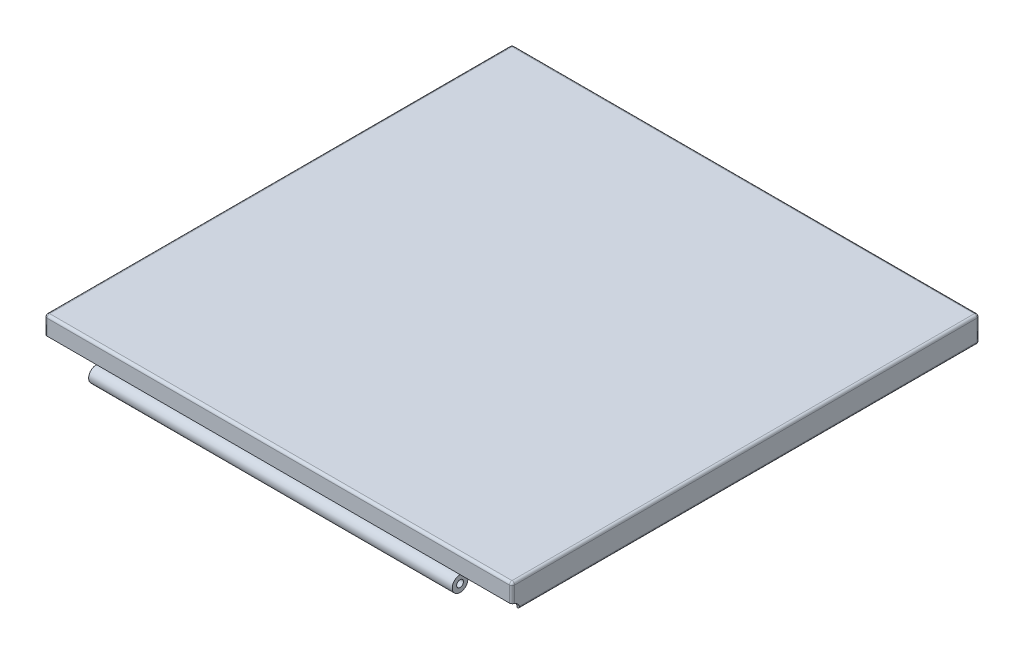
ISO-10303-21;
HEADER;
FILE_DESCRIPTION(('STEP AP214'),'2;1');
FILE_NAME('part.step','',(''),(''),'','','');
FILE_SCHEMA(('AUTOMOTIVE_DESIGN { 1 0 10303 214 1 1 1 1 }'));
ENDSEC;
DATA;
#1=APPLICATION_CONTEXT('core data for automotive mechanical design processes');
#2=APPLICATION_PROTOCOL_DEFINITION('international standard','automotive_design',2000,#1);
#3=PRODUCT_CONTEXT('',#1,'mechanical');
#4=PRODUCT('Part','Part','',(#3));
#5=PRODUCT_RELATED_PRODUCT_CATEGORY('part','',(#4));
#6=PRODUCT_DEFINITION_FORMATION('','',#4);
#7=PRODUCT_DEFINITION_CONTEXT('part definition',#1,'design');
#8=PRODUCT_DEFINITION('design','',#6,#7);
#9=PRODUCT_DEFINITION_SHAPE('','',#8);
#10=(LENGTH_UNIT() NAMED_UNIT(*) SI_UNIT(.MILLI.,.METRE.));
#11=(NAMED_UNIT(*) PLANE_ANGLE_UNIT() SI_UNIT($,.RADIAN.));
#12=(NAMED_UNIT(*) SI_UNIT($,.STERADIAN.) SOLID_ANGLE_UNIT());
#13=UNCERTAINTY_MEASURE_WITH_UNIT(LENGTH_MEASURE(1.E-05),#10,'distance_accuracy_value','');
#14=(GEOMETRIC_REPRESENTATION_CONTEXT(3) GLOBAL_UNCERTAINTY_ASSIGNED_CONTEXT((#13)) GLOBAL_UNIT_ASSIGNED_CONTEXT((#10,
#11,#12)) REPRESENTATION_CONTEXT('',''));
#15=CARTESIAN_POINT('',(0.,0.,0.));
#16=DIRECTION('',(0.,0.,1.));
#17=DIRECTION('',(1.,0.,0.));
#18=AXIS2_PLACEMENT_3D('',#15,#16,#17);
#19=CARTESIAN_POINT('',(114.3,12.7,114.3));
#20=DIRECTION('',(0.,0.,-1.));
#21=DIRECTION('',(-1.,0.,0.));
#22=AXIS2_PLACEMENT_3D('',#19,#20,#21);
#23=PLANE('',#22);
#24=DIRECTION('',(1.,0.,0.));
#25=VECTOR('',#24,1.);
#26=CARTESIAN_POINT('',(-125.076307345283,3.81000000000001,114.3));
#27=LINE('',#26,#25);
#28=CARTESIAN_POINT('',(-88.9,3.81000000000001,114.3));
#29=VERTEX_POINT('',#28);
#30=CARTESIAN_POINT('',(-113.03,3.81000000000001,114.3));
#31=VERTEX_POINT('',#30);
#32=EDGE_CURVE('E172',#29,#31,#27,.F.);
#33=ORIENTED_EDGE('',*,*,#32,.F.);
#34=DIRECTION('',(-1.,0.,0.));
#35=VECTOR('',#34,1.);
#36=CARTESIAN_POINT('',(88.9,3.81000000000001,114.3));
#37=LINE('',#36,#35);
#38=CARTESIAN_POINT('',(88.9,3.81000000000001,114.3));
#39=VERTEX_POINT('',#38);
#40=EDGE_CURVE('E259',#39,#29,#37,.T.);
#41=ORIENTED_EDGE('',*,*,#40,.F.);
#42=DIRECTION('',(-1.,0.,0.));
#43=VECTOR('',#42,1.);
#44=CARTESIAN_POINT('',(125.076307345283,3.81000000000001,114.3));
#45=LINE('',#44,#43);
#46=CARTESIAN_POINT('',(113.03,3.81000000000001,114.3));
#47=VERTEX_POINT('',#46);
#48=EDGE_CURVE('E489',#47,#39,#45,.T.);
#49=ORIENTED_EDGE('',*,*,#48,.F.);
#50=DIRECTION('',(0.,-1.,0.));
#51=VECTOR('',#50,1.);
#52=CARTESIAN_POINT('',(113.03,12.7,114.3));
#53=LINE('',#52,#51);
#54=CARTESIAN_POINT('',(113.03,11.43,114.3));
#55=VERTEX_POINT('',#54);
#56=EDGE_CURVE('E238',#47,#55,#53,.F.);
#57=ORIENTED_EDGE('',*,*,#56,.T.);
#58=DIRECTION('',(1.,0.,0.));
#59=VECTOR('',#58,1.);
#60=CARTESIAN_POINT('',(-114.3,11.43,114.3));
#61=LINE('',#60,#59);
#62=CARTESIAN_POINT('',(-113.03,11.43,114.3));
#63=VERTEX_POINT('',#62);
#64=EDGE_CURVE('E235',#55,#63,#61,.F.);
#65=ORIENTED_EDGE('',*,*,#64,.T.);
#66=DIRECTION('',(0.,-1.,0.));
#67=VECTOR('',#66,1.);
#68=CARTESIAN_POINT('',(-113.03,12.7,114.3));
#69=LINE('',#68,#67);
#70=EDGE_CURVE('E241',#63,#31,#69,.T.);
#71=ORIENTED_EDGE('',*,*,#70,.T.);
#72=EDGE_LOOP('',(#33,#41,#49,#57,#65,#71));
#73=FACE_BOUND('',#72,.T.);
#74=ADVANCED_FACE('F44',(#73),#23,.F.);
#75=CARTESIAN_POINT('',(114.3,12.7,113.03));
#76=DIRECTION('',(0.,0.,-1.));
#77=DIRECTION('',(-1.,0.,0.));
#78=AXIS2_PLACEMENT_3D('',#75,#76,#77);
#79=PLANE('',#78);
#80=DIRECTION('',(-1.,0.,0.));
#81=VECTOR('',#80,1.);
#82=CARTESIAN_POINT('',(88.9,3.59210244842768,113.03));
#83=LINE('',#82,#81);
#84=CARTESIAN_POINT('',(88.9,3.59210244842768,113.03));
#85=VERTEX_POINT('',#84);
#86=CARTESIAN_POINT('',(-88.9,3.59210244842769,113.03));
#87=VERTEX_POINT('',#86);
#88=EDGE_CURVE('E53',#85,#87,#83,.T.);
#89=ORIENTED_EDGE('',*,*,#88,.T.);
#90=DIRECTION('',(1.,0.,0.));
#91=VECTOR('',#90,1.);
#92=CARTESIAN_POINT('',(-125.076307345283,3.59210244842769,113.03));
#93=LINE('',#92,#91);
#94=CARTESIAN_POINT('',(-113.03,3.59210244842769,113.03));
#95=VERTEX_POINT('',#94);
#96=EDGE_CURVE('E178',#87,#95,#93,.F.);
#97=ORIENTED_EDGE('',*,*,#96,.T.);
#98=DIRECTION('',(0.,-1.,0.));
#99=VECTOR('',#98,1.);
#100=CARTESIAN_POINT('',(-113.03,12.7,113.03));
#101=LINE('',#100,#99);
#102=CARTESIAN_POINT('',(-113.03,11.43,113.03));
#103=VERTEX_POINT('',#102);
#104=EDGE_CURVE('E202',#103,#95,#101,.T.);
#105=ORIENTED_EDGE('',*,*,#104,.F.);
#106=DIRECTION('',(1.,0.,0.));
#107=VECTOR('',#106,1.);
#108=CARTESIAN_POINT('',(114.3,11.43,113.03));
#109=LINE('',#108,#107);
#110=CARTESIAN_POINT('',(113.03,11.43,113.03));
#111=VERTEX_POINT('',#110);
#112=EDGE_CURVE('E364',#103,#111,#109,.T.);
#113=ORIENTED_EDGE('',*,*,#112,.T.);
#114=DIRECTION('',(0.,-1.,0.));
#115=VECTOR('',#114,1.);
#116=CARTESIAN_POINT('',(113.03,12.7,113.03));
#117=LINE('',#116,#115);
#118=CARTESIAN_POINT('',(113.03,3.59210244842768,113.03));
#119=VERTEX_POINT('',#118);
#120=EDGE_CURVE('E359',#111,#119,#117,.T.);
#121=ORIENTED_EDGE('',*,*,#120,.T.);
#122=DIRECTION('',(-1.,0.,0.));
#123=VECTOR('',#122,1.);
#124=CARTESIAN_POINT('',(125.076307345283,3.59210244842768,113.03));
#125=LINE('',#124,#123);
#126=EDGE_CURVE('E332',#119,#85,#125,.T.);
#127=ORIENTED_EDGE('',*,*,#126,.T.);
#128=EDGE_LOOP('',(#89,#97,#105,#113,#121,#127));
#129=FACE_BOUND('',#128,.T.);
#130=ADVANCED_FACE('F328',(#129),#79,.T.);
#131=CARTESIAN_POINT('',(-114.3,0.,114.3));
#132=DIRECTION('',(1.,0.,0.));
#133=DIRECTION('',(0.,0.,-1.));
#134=AXIS2_PLACEMENT_3D('',#131,#132,#133);
#135=CYLINDRICAL_SURFACE('',#134,1.65099999999998);
#136=CARTESIAN_POINT('',(88.9,0.,114.3));
#137=DIRECTION('',(1.,0.,0.));
#138=DIRECTION('',(0.,0.,-1.));
#139=AXIS2_PLACEMENT_3D('',#136,#137,#138);
#140=CIRCLE('',#139,1.65099999999998);
#141=CARTESIAN_POINT('',(88.9,0.,112.649));
#142=VERTEX_POINT('',#141);
#143=EDGE_CURVE('E352',#142,#142,#140,.T.);
#144=CARTESIAN_POINT('',(-88.9,0.,114.3));
#145=DIRECTION('',(1.,0.,0.));
#146=DIRECTION('',(0.,0.,-1.));
#147=AXIS2_PLACEMENT_3D('',#144,#145,#146);
#148=CIRCLE('',#147,1.65099999999998);
#149=CARTESIAN_POINT('',(-88.9,0.,112.649));
#150=VERTEX_POINT('',#149);
#151=EDGE_CURVE('E11',#150,#150,#148,.T.);
#152=CARTESIAN_POINT('',(88.9,0.,112.649));
#153=CARTESIAN_POINT('',(87.0479166666667,0.,112.649));
#154=CARTESIAN_POINT('',(85.1958333333333,0.,112.649));
#155=CARTESIAN_POINT('',(81.4916666666667,0.,112.649));
#156=CARTESIAN_POINT('',(79.6395833333333,0.,112.649));
#157=CARTESIAN_POINT('',(75.9354166666667,0.,112.649));
#158=CARTESIAN_POINT('',(74.0833333333333,0.,112.649));
#159=CARTESIAN_POINT('',(70.3791666666667,0.,112.649));
#160=CARTESIAN_POINT('',(68.5270833333333,0.,112.649));
#161=CARTESIAN_POINT('',(64.8229166666667,0.,112.649));
#162=CARTESIAN_POINT('',(62.9708333333333,0.,112.649));
#163=CARTESIAN_POINT('',(59.2666666666667,0.,112.649));
#164=CARTESIAN_POINT('',(57.4145833333333,0.,112.649));
#165=CARTESIAN_POINT('',(53.7104166666666,0.,112.649));
#166=CARTESIAN_POINT('',(51.8583333333333,0.,112.649));
#167=CARTESIAN_POINT('',(48.1541666666667,0.,112.649));
#168=CARTESIAN_POINT('',(46.3020833333333,0.,112.649));
#169=CARTESIAN_POINT('',(42.5979166666667,0.,112.649));
#170=CARTESIAN_POINT('',(40.7458333333333,0.,112.649));
#171=CARTESIAN_POINT('',(37.0416666666667,0.,112.649));
#172=CARTESIAN_POINT('',(35.1895833333333,0.,112.649));
#173=CARTESIAN_POINT('',(31.4854166666666,0.,112.649));
#174=CARTESIAN_POINT('',(29.6333333333333,0.,112.649));
#175=CARTESIAN_POINT('',(25.9291666666667,0.,112.649));
#176=CARTESIAN_POINT('',(24.0770833333333,0.,112.649));
#177=CARTESIAN_POINT('',(20.3729166666666,0.,112.649));
#178=CARTESIAN_POINT('',(18.5208333333333,0.,112.649));
#179=CARTESIAN_POINT('',(14.8166666666666,0.,112.649));
#180=CARTESIAN_POINT('',(12.9645833333333,0.,112.649));
#181=CARTESIAN_POINT('',(9.26041666666666,0.,112.649));
#182=CARTESIAN_POINT('',(7.40833333333333,0.,112.649));
#183=CARTESIAN_POINT('',(3.70416666666667,0.,112.649));
#184=CARTESIAN_POINT('',(1.85208333333333,0.,112.649));
#185=CARTESIAN_POINT('',(-1.85208333333333,0.,112.649));
#186=CARTESIAN_POINT('',(-3.70416666666667,0.,112.649));
#187=CARTESIAN_POINT('',(-7.40833333333333,0.,112.649));
#188=CARTESIAN_POINT('',(-9.26041666666666,0.,112.649));
#189=CARTESIAN_POINT('',(-12.9645833333333,0.,112.649));
#190=CARTESIAN_POINT('',(-14.8166666666667,0.,112.649));
#191=CARTESIAN_POINT('',(-18.5208333333333,0.,112.649));
#192=CARTESIAN_POINT('',(-20.3729166666667,0.,112.649));
#193=CARTESIAN_POINT('',(-24.0770833333333,0.,112.649));
#194=CARTESIAN_POINT('',(-25.9291666666667,0.,112.649));
#195=CARTESIAN_POINT('',(-29.6333333333333,0.,112.649));
#196=CARTESIAN_POINT('',(-31.4854166666667,0.,112.649));
#197=CARTESIAN_POINT('',(-35.1895833333333,0.,112.649));
#198=CARTESIAN_POINT('',(-37.0416666666667,0.,112.649));
#199=CARTESIAN_POINT('',(-40.7458333333333,0.,112.649));
#200=CARTESIAN_POINT('',(-42.5979166666667,0.,112.649));
#201=CARTESIAN_POINT('',(-46.3020833333333,0.,112.649));
#202=CARTESIAN_POINT('',(-48.1541666666667,0.,112.649));
#203=CARTESIAN_POINT('',(-51.8583333333333,0.,112.649));
#204=CARTESIAN_POINT('',(-53.7104166666667,0.,112.649));
#205=CARTESIAN_POINT('',(-57.4145833333333,0.,112.649));
#206=CARTESIAN_POINT('',(-59.2666666666667,0.,112.649));
#207=CARTESIAN_POINT('',(-62.9708333333333,0.,112.649));
#208=CARTESIAN_POINT('',(-64.8229166666667,0.,112.649));
#209=CARTESIAN_POINT('',(-68.5270833333333,0.,112.649));
#210=CARTESIAN_POINT('',(-70.3791666666667,0.,112.649));
#211=CARTESIAN_POINT('',(-74.0833333333333,0.,112.649));
#212=CARTESIAN_POINT('',(-75.9354166666667,0.,112.649));
#213=CARTESIAN_POINT('',(-79.6395833333333,0.,112.649));
#214=CARTESIAN_POINT('',(-81.4916666666667,0.,112.649));
#215=CARTESIAN_POINT('',(-85.1958333333333,0.,112.649));
#216=CARTESIAN_POINT('',(-87.0479166666667,0.,112.649));
#217=CARTESIAN_POINT('',(-88.9,0.,112.649));
#218=B_SPLINE_CURVE_WITH_KNOTS('',3,(#152,#153,#154,#155,#156,#157,#158,#159,#160,#161,#162,
#163,#164,#165,#166,#167,#168,#169,#170,#171,#172,#173,#174,#175,#176,#177,#178,#179,#180,#181,
#182,#183,#184,#185,#186,#187,#188,#189,#190,#191,#192,#193,#194,#195,#196,#197,#198,#199,#200,
#201,#202,#203,#204,#205,#206,#207,#208,#209,#210,#211,#212,#213,#214,#215,#216,#217),
.UNSPECIFIED.,.F.,.F.,(4,2,2,2,2,2,2,2,2,2,2,2,2,2,2,2,2,2,2,2,2,2,2,2,2,2,2,2,2,2,2,2,4),(0.,
5.55625000000001,11.1125,16.66875,22.225,27.78125,33.3375,38.89375,44.45,50.00625,55.5625,
61.11875,66.675,72.23125,77.7875,83.34375,88.9,94.45625,100.0125,105.56875,111.125,116.68125,
122.2375,127.79375,133.35,138.90625,144.4625,150.01875,155.575,161.13125,166.6875,172.24375,
177.8),.UNSPECIFIED.);
#219=EDGE_CURVE('BSEAM479',#142,#150,#218,.T.);
#220=ORIENTED_EDGE('',*,*,#143,.T.);
#221=ORIENTED_EDGE('',*,*,#151,.F.);
#222=ORIENTED_EDGE('',*,*,#219,.T.);
#223=ORIENTED_EDGE('',*,*,#219,.F.);
#224=EDGE_LOOP('',(#220,#222,#221,#223));
#225=FACE_BOUND('',#224,.T.);
#226=ADVANCED_FACE('F479',(#225),#135,.F.);
#227=CARTESIAN_POINT('',(-113.03,12.7,113.03));
#228=DIRECTION('',(0.,-1.,0.));
#229=DIRECTION('',(0.,0.,-1.));
#230=AXIS2_PLACEMENT_3D('',#227,#228,#229);
#231=CYLINDRICAL_SURFACE('',#230,1.27);
#232=DIRECTION('',(0.,-1.,0.));
#233=VECTOR('',#232,1.);
#234=CARTESIAN_POINT('',(-114.3,12.7,113.03));
#235=LINE('',#234,#233);
#236=CARTESIAN_POINT('',(-114.3,3.59210244842769,113.03));
#237=VERTEX_POINT('',#236);
#238=CARTESIAN_POINT('',(-114.3,11.43,113.03));
#239=VERTEX_POINT('',#238);
#240=EDGE_CURVE('E183',#237,#239,#235,.F.);
#241=ORIENTED_EDGE('',*,*,#240,.F.);
#242=CARTESIAN_POINT('',(-114.3,3.59210244842769,113.03));
#243=CARTESIAN_POINT('',(-114.299999730832,3.60395342017345,113.063513010061));
#244=CARTESIAN_POINT('',(-114.298672245197,3.61532664849105,113.097182371875));
#245=CARTESIAN_POINT('',(-114.293297186261,3.63707352979692,113.164636357744));
#246=CARTESIAN_POINT('',(-114.289248832206,3.64744689489697,113.198421012114));
#247=CARTESIAN_POINT('',(-114.272934354231,3.67697435725504,113.29956477133));
#248=CARTESIAN_POINT('',(-114.256499033481,3.69455626429702,113.366771736512));
#249=CARTESIAN_POINT('',(-114.212436430446,3.7253816406979,113.498603936007));
#250=CARTESIAN_POINT('',(-114.184785078813,3.73861566835664,113.563223287607));
#251=CARTESIAN_POINT('',(-114.118824901333,3.76097389686656,113.68749677385));
#252=CARTESIAN_POINT('',(-114.080524187735,3.77010121224139,113.747154643186));
#253=CARTESIAN_POINT('',(-113.995484344228,3.78466964168169,113.857938660787));
#254=CARTESIAN_POINT('',(-113.949010439519,3.79020648988001,113.909256395814));
#255=CARTESIAN_POINT('',(-113.848200405144,3.79876341253541,114.003767749155));
#256=CARTESIAN_POINT('',(-113.793861104328,3.80178246854044,114.046958074451));
#257=CARTESIAN_POINT('',(-113.678228213804,3.80614891804898,114.124345865882));
#258=CARTESIAN_POINT('',(-113.616867155018,3.80747829482191,114.158443395245));
#259=CARTESIAN_POINT('',(-113.489369090119,3.80918485194009,114.216073772755));
#260=CARTESIAN_POINT('',(-113.423233607697,3.80956233469944,114.239609974254));
#261=CARTESIAN_POINT('',(-113.302555498846,3.80992133611994,114.2716243187));
#262=CARTESIAN_POINT('',(-113.248571589362,3.80997045548781,114.282250239369));
#263=CARTESIAN_POINT('',(-113.139731348591,3.80999976117242,114.296443304013));
#264=CARTESIAN_POINT('',(-113.084875805904,3.80998000662043,114.300016498936));
#265=CARTESIAN_POINT('',(-113.03,3.81000000000001,114.3));
#266=B_SPLINE_CURVE_WITH_KNOTS('',3,(#242,#243,#244,#245,#246,#247,#248,#249,#250,#251,#252,
#253,#254,#255,#256,#257,#258,#259,#260,#261,#262,#263,#264,#265),.UNSPECIFIED.,.F.,.F.,(4,2,2,
2,2,2,2,2,2,2,2,4),(0.,0.106585107547144,0.213200812786025,0.426249810301429,0.639758445608502,
0.853104882260133,1.06049936231199,1.26797769321732,1.47765026009959,1.68725620618885,
1.85187078374446,2.01634406729467),.UNSPECIFIED.);
#267=EDGE_CURVE('E169',#237,#31,#266,.T.);
#268=ORIENTED_EDGE('',*,*,#267,.T.);
#269=ORIENTED_EDGE('',*,*,#70,.F.);
#270=CARTESIAN_POINT('',(-113.03,11.43,113.03));
#271=DIRECTION('',(0.,1.,0.));
#272=DIRECTION('',(0.,0.,1.));
#273=AXIS2_PLACEMENT_3D('',#270,#271,#272);
#274=CIRCLE('',#273,1.27);
#275=EDGE_CURVE('E194',#63,#239,#274,.F.);
#276=ORIENTED_EDGE('',*,*,#275,.T.);
#277=EDGE_LOOP('',(#241,#268,#269,#276));
#278=FACE_BOUND('',#277,.T.);
#279=ADVANCED_FACE('F192',(#278),#231,.T.);
#280=CARTESIAN_POINT('',(-113.03,1.27,114.3));
#281=DIRECTION('',(0.,0.,1.));
#282=DIRECTION('',(1.,0.,0.));
#283=AXIS2_PLACEMENT_3D('',#280,#281,#282);
#284=CYLINDRICAL_SURFACE('',#283,1.27);
#285=DIRECTION('',(0.,0.,1.));
#286=VECTOR('',#285,1.);
#287=CARTESIAN_POINT('',(-113.03,0.,114.3));
#288=LINE('',#287,#286);
#289=CARTESIAN_POINT('',(-113.03,0.,-113.03));
#290=VERTEX_POINT('',#289);
#291=CARTESIAN_POINT('',(-113.03,0.,110.49));
#292=VERTEX_POINT('',#291);
#293=EDGE_CURVE('E321',#290,#292,#288,.T.);
#294=ORIENTED_EDGE('',*,*,#293,.T.);
#295=CARTESIAN_POINT('',(-113.03,0.,110.49));
#296=CARTESIAN_POINT('',(-113.06569180478,2.42712029706028E-07,110.490002882391));
#297=CARTESIAN_POINT('',(-113.101366521661,0.00150555562838172,110.489999675541));
#298=CARTESIAN_POINT('',(-113.172461393225,0.00751091564200149,110.490005658736));
#299=CARTESIAN_POINT('',(-113.207881558863,0.0120108330836344,110.490014848245));
#300=CARTESIAN_POINT('',(-113.313332076448,0.0299621750192666,110.490097788749));
#301=CARTESIAN_POINT('',(-113.382657438353,0.0478652915658304,110.490226777436));
#302=CARTESIAN_POINT('',(-113.517323023573,0.0950463010961808,110.49111348022));
#303=CARTESIAN_POINT('',(-113.582661069672,0.124330345291957,110.491871534568));
#304=CARTESIAN_POINT('',(-113.707479361027,0.193428776192033,110.494756732604));
#305=CARTESIAN_POINT('',(-113.766960560917,0.233241442873028,110.496883652747));
#306=CARTESIAN_POINT('',(-113.878077063348,0.322002694986323,110.503372664282));
#307=CARTESIAN_POINT('',(-113.929747326381,0.370908246093849,110.507724389338));
#308=CARTESIAN_POINT('',(-114.024058894266,0.476431717084375,110.519534033712));
#309=CARTESIAN_POINT('',(-114.066702527566,0.533047641845049,110.52699115051));
#310=CARTESIAN_POINT('',(-114.141074679166,0.650982315672664,110.545560775685));
#311=CARTESIAN_POINT('',(-114.172993710987,0.712192361402362,110.55660176584));
#312=CARTESIAN_POINT('',(-114.22630990199,0.838232674472518,110.582796232106));
#313=CARTESIAN_POINT('',(-114.247705403832,0.903063510258814,110.597950355406));
#314=CARTESIAN_POINT('',(-114.27593139301,1.01859311576174,110.62831953401));
#315=CARTESIAN_POINT('',(-114.28501495666,1.06898863718235,110.64266413315));
#316=CARTESIAN_POINT('',(-114.297052182924,1.16971861906002,110.673614998505));
#317=CARTESIAN_POINT('',(-114.300017030637,1.22005302253359,110.690217078668));
#318=CARTESIAN_POINT('',(-114.3,1.27,110.707897551572));
#319=B_SPLINE_CURVE_WITH_KNOTS('',3,(#295,#296,#297,#298,#299,#300,#301,#302,#303,#304,#305,
#306,#307,#308,#309,#310,#311,#312,#313,#314,#315,#316,#317,#318),.UNSPECIFIED.,.F.,.F.,(4,2,2,
2,2,2,2,2,2,2,2,4),(0.,0.107009736099259,0.214014839362178,0.427714078346772,0.641528979390755,
0.855308971815977,1.06810182698581,1.28083972451135,1.48956943609269,1.69833200981209,
1.85747904439642,2.01633489731665),.UNSPECIFIED.);
#320=CARTESIAN_POINT('',(-114.3,1.27,110.707897551572));
#321=VERTEX_POINT('',#320);
#322=EDGE_CURVE('E188',#292,#321,#319,.T.);
#323=ORIENTED_EDGE('',*,*,#322,.T.);
#324=DIRECTION('',(0.,0.,1.));
#325=VECTOR('',#324,1.);
#326=CARTESIAN_POINT('',(-114.3,1.27,114.3));
#327=LINE('',#326,#325);
#328=CARTESIAN_POINT('',(-114.3,1.27,-113.03));
#329=VERTEX_POINT('',#328);
#330=EDGE_CURVE('E186',#329,#321,#327,.T.);
#331=ORIENTED_EDGE('',*,*,#330,.F.);
#332=CARTESIAN_POINT('',(-113.03,1.27,-113.03));
#333=DIRECTION('',(0.,0.,-1.));
#334=DIRECTION('',(-1.,0.,0.));
#335=AXIS2_PLACEMENT_3D('',#332,#333,#334);
#336=CIRCLE('',#335,1.27);
#337=EDGE_CURVE('E255',#329,#290,#336,.F.);
#338=ORIENTED_EDGE('',*,*,#337,.T.);
#339=EDGE_LOOP('',(#294,#323,#331,#338));
#340=FACE_BOUND('',#339,.T.);
#341=ADVANCED_FACE('F494',(#340),#284,.T.);
#342=CARTESIAN_POINT('',(113.03,12.7,113.03));
#343=DIRECTION('',(0.,-1.,0.));
#344=DIRECTION('',(0.,0.,-1.));
#345=AXIS2_PLACEMENT_3D('',#342,#343,#344);
#346=CYLINDRICAL_SURFACE('',#345,1.27);
#347=ORIENTED_EDGE('',*,*,#56,.F.);
#348=CARTESIAN_POINT('',(113.03,3.81000000000001,114.3));
#349=CARTESIAN_POINT('',(113.06569180478,3.80999711760852,114.299999757288));
#350=CARTESIAN_POINT('',(113.101366521661,3.81000032445873,114.298494444372));
#351=CARTESIAN_POINT('',(113.172461393225,3.80999434126383,114.292489084358));
#352=CARTESIAN_POINT('',(113.207881558863,3.80998515175542,114.287989166916));
#353=CARTESIAN_POINT('',(113.313332076448,3.80990221125076,114.270037824981));
#354=CARTESIAN_POINT('',(113.382657438353,3.80977322256354,114.252134708434));
#355=CARTESIAN_POINT('',(113.517323023573,3.80888651978016,114.204953698904));
#356=CARTESIAN_POINT('',(113.582661069672,3.80812846543196,114.175669654708));
#357=CARTESIAN_POINT('',(113.707479361027,3.80524326739586,114.106571223808));
#358=CARTESIAN_POINT('',(113.766960560917,3.80311634725335,114.066758557127));
#359=CARTESIAN_POINT('',(113.878077063348,3.79662733571756,113.977997305014));
#360=CARTESIAN_POINT('',(113.929747326381,3.7922756106621,113.929091753906));
#361=CARTESIAN_POINT('',(114.024058894266,3.78046596628763,113.823568282916));
#362=CARTESIAN_POINT('',(114.066702527566,3.77300884949034,113.766952358155));
#363=CARTESIAN_POINT('',(114.141074679166,3.75443922431538,113.649017684327));
#364=CARTESIAN_POINT('',(114.172993710987,3.74339823415974,113.587807638598));
#365=CARTESIAN_POINT('',(114.22630990199,3.71720376789425,113.461767325527));
#366=CARTESIAN_POINT('',(114.247705403832,3.70204964459356,113.396936489741));
#367=CARTESIAN_POINT('',(114.27593139301,3.67168046598952,113.281406884238));
#368=CARTESIAN_POINT('',(114.28501495666,3.65733586685047,113.231011362818));
#369=CARTESIAN_POINT('',(114.297052182924,3.6263850014946,113.13028138094));
#370=CARTESIAN_POINT('',(114.300017030637,3.60978292133238,113.079946977466));
#371=CARTESIAN_POINT('',(114.3,3.59210244842768,113.03));
#372=B_SPLINE_CURVE_WITH_KNOTS('',3,(#348,#349,#350,#351,#352,#353,#354,#355,#356,#357,#358,
#359,#360,#361,#362,#363,#364,#365,#366,#367,#368,#369,#370,#371),.UNSPECIFIED.,.F.,.F.,(4,2,2,
2,2,2,2,2,2,2,2,4),(0.,0.107009736099258,0.214014839362178,0.427714078346774,0.641528979390771,
0.85530897181599,1.06810182698583,1.28083972451135,1.4895694360927,1.69833200981209,
1.85747904439641,2.01633489731663),.UNSPECIFIED.);
#373=CARTESIAN_POINT('',(114.3,3.59210244842768,113.03));
#374=VERTEX_POINT('',#373);
#375=EDGE_CURVE('E483',#47,#374,#372,.T.);
#376=ORIENTED_EDGE('',*,*,#375,.T.);
#377=DIRECTION('',(0.,-1.,0.));
#378=VECTOR('',#377,1.);
#379=CARTESIAN_POINT('',(114.3,12.7,113.03));
#380=LINE('',#379,#378);
#381=CARTESIAN_POINT('',(114.3,11.43,113.03));
#382=VERTEX_POINT('',#381);
#383=EDGE_CURVE('E224',#382,#374,#380,.T.);
#384=ORIENTED_EDGE('',*,*,#383,.F.);
#385=CARTESIAN_POINT('',(113.03,11.43,113.03));
#386=DIRECTION('',(0.,1.,0.));
#387=DIRECTION('',(0.,0.,1.));
#388=AXIS2_PLACEMENT_3D('',#385,#386,#387);
#389=CIRCLE('',#388,1.27);
#390=EDGE_CURVE('E299',#382,#55,#389,.F.);
#391=ORIENTED_EDGE('',*,*,#390,.T.);
#392=EDGE_LOOP('',(#347,#376,#384,#391));
#393=FACE_BOUND('',#392,.T.);
#394=ADVANCED_FACE('F490',(#393),#346,.T.);
#395=CARTESIAN_POINT('',(113.03,1.27,114.3));
#396=DIRECTION('',(0.,0.,-1.));
#397=DIRECTION('',(-1.,0.,0.));
#398=AXIS2_PLACEMENT_3D('',#395,#396,#397);
#399=CYLINDRICAL_SURFACE('',#398,1.27);
#400=DIRECTION('',(0.,0.,-1.));
#401=VECTOR('',#400,1.);
#402=CARTESIAN_POINT('',(114.3,1.27,114.3));
#403=LINE('',#402,#401);
#404=CARTESIAN_POINT('',(114.3,1.27,110.707897551572));
#405=VERTEX_POINT('',#404);
#406=CARTESIAN_POINT('',(114.3,1.27,-113.03));
#407=VERTEX_POINT('',#406);
#408=EDGE_CURVE('E228',#405,#407,#403,.T.);
#409=ORIENTED_EDGE('',*,*,#408,.F.);
#410=CARTESIAN_POINT('',(114.3,1.27,110.707897551572));
#411=CARTESIAN_POINT('',(114.299999730832,1.2364869899388,110.696046579827));
#412=CARTESIAN_POINT('',(114.298672245197,1.20281762812502,110.684673351509));
#413=CARTESIAN_POINT('',(114.293297186261,1.13536364225555,110.662926470203));
#414=CARTESIAN_POINT('',(114.289248832206,1.10157898788594,110.652553105103));
#415=CARTESIAN_POINT('',(114.272934354231,1.00043522866997,110.623025642745));
#416=CARTESIAN_POINT('',(114.256499033481,0.933228263487754,110.605443735703));
#417=CARTESIAN_POINT('',(114.212436430446,0.801396063993355,110.574618359302));
#418=CARTESIAN_POINT('',(114.184785078813,0.736776712393067,110.561384331643));
#419=CARTESIAN_POINT('',(114.118824901333,0.612503226149748,110.539026103133));
#420=CARTESIAN_POINT('',(114.080524187735,0.552845356813944,110.529898787759));
#421=CARTESIAN_POINT('',(113.995484344228,0.442061339212964,110.515330358318));
#422=CARTESIAN_POINT('',(113.949010439519,0.39074360418594,110.50979351012));
#423=CARTESIAN_POINT('',(113.848200405144,0.296232250844943,110.501236587465));
#424=CARTESIAN_POINT('',(113.793861104328,0.253041925549491,110.49821753146));
#425=CARTESIAN_POINT('',(113.678228213804,0.175654134117561,110.493851081951));
#426=CARTESIAN_POINT('',(113.616867155018,0.141556604755197,110.492521705178));
#427=CARTESIAN_POINT('',(113.489369090119,0.0839262272448961,110.49081514806));
#428=CARTESIAN_POINT('',(113.423233607697,0.0603900257461725,110.490437665301));
#429=CARTESIAN_POINT('',(113.302555498846,0.0283756812998778,110.49007866388));
#430=CARTESIAN_POINT('',(113.248571589362,0.0177497606305407,110.490029544512));
#431=CARTESIAN_POINT('',(113.139731348591,0.00355669598653317,110.490000238828));
#432=CARTESIAN_POINT('',(113.084875805904,-1.64989355400819E-05,110.49001999338));
#433=CARTESIAN_POINT('',(113.03,0.,110.49));
#434=B_SPLINE_CURVE_WITH_KNOTS('',3,(#410,#411,#412,#413,#414,#415,#416,#417,#418,#419,#420,
#421,#422,#423,#424,#425,#426,#427,#428,#429,#430,#431,#432,#433),.UNSPECIFIED.,.F.,.F.,(4,2,2,
2,2,2,2,2,2,2,2,4),(0.,0.106585107547139,0.213200812786032,0.426249810301425,0.639758445608494,
0.853104882260123,1.06049936231198,1.26797769321733,1.4776502600996,1.68725620618884,
1.85187078374447,2.01634406729469),.UNSPECIFIED.);
#435=CARTESIAN_POINT('',(113.03,0.,110.49));
#436=VERTEX_POINT('',#435);
#437=EDGE_CURVE('E397',#405,#436,#434,.T.);
#438=ORIENTED_EDGE('',*,*,#437,.T.);
#439=DIRECTION('',(0.,0.,-1.));
#440=VECTOR('',#439,1.);
#441=CARTESIAN_POINT('',(113.03,0.,114.3));
#442=LINE('',#441,#440);
#443=CARTESIAN_POINT('',(113.03,0.,-113.03));
#444=VERTEX_POINT('',#443);
#445=EDGE_CURVE('E387',#436,#444,#442,.T.);
#446=ORIENTED_EDGE('',*,*,#445,.T.);
#447=CARTESIAN_POINT('',(113.03,1.27,-113.03));
#448=DIRECTION('',(0.,0.,-1.));
#449=DIRECTION('',(-1.,0.,0.));
#450=AXIS2_PLACEMENT_3D('',#447,#448,#449);
#451=CIRCLE('',#450,1.27);
#452=EDGE_CURVE('E295',#407,#444,#451,.T.);
#453=ORIENTED_EDGE('',*,*,#452,.F.);
#454=EDGE_LOOP('',(#409,#438,#446,#453));
#455=FACE_BOUND('',#454,.T.);
#456=ADVANCED_FACE('F396',(#455),#399,.T.);
#457=CARTESIAN_POINT('',(-114.3,12.7,114.3));
#458=DIRECTION('',(1.,0.,0.));
#459=DIRECTION('',(0.,0.,-1.));
#460=AXIS2_PLACEMENT_3D('',#457,#458,#459);
#461=PLANE('',#460);
#462=CARTESIAN_POINT('',(-114.3,0.,114.3));
#463=DIRECTION('',(1.,0.,0.));
#464=DIRECTION('',(0.,0.,-1.));
#465=AXIS2_PLACEMENT_3D('',#462,#463,#464);
#466=CIRCLE('',#465,3.81000000000001);
#467=EDGE_CURVE('E60',#321,#237,#466,.T.);
#468=ORIENTED_EDGE('',*,*,#467,.T.);
#469=ORIENTED_EDGE('',*,*,#240,.T.);
#470=DIRECTION('',(0.,0.,1.));
#471=VECTOR('',#470,1.);
#472=CARTESIAN_POINT('',(-114.3,11.43,-114.3));
#473=LINE('',#472,#471);
#474=CARTESIAN_POINT('',(-114.3,11.43,-113.03));
#475=VERTEX_POINT('',#474);
#476=EDGE_CURVE('E197',#239,#475,#473,.F.);
#477=ORIENTED_EDGE('',*,*,#476,.T.);
#478=DIRECTION('',(0.,-1.,0.));
#479=VECTOR('',#478,1.);
#480=CARTESIAN_POINT('',(-114.3,12.7,-113.03));
#481=LINE('',#480,#479);
#482=EDGE_CURVE('E196',#475,#329,#481,.T.);
#483=ORIENTED_EDGE('',*,*,#482,.T.);
#484=ORIENTED_EDGE('',*,*,#330,.T.);
#485=EDGE_LOOP('',(#468,#469,#477,#483,#484));
#486=FACE_BOUND('',#485,.T.);
#487=ADVANCED_FACE('F182',(#486),#461,.F.);
#488=CARTESIAN_POINT('',(114.3,12.7,114.3));
#489=DIRECTION('',(-1.,0.,0.));
#490=DIRECTION('',(0.,0.,1.));
#491=AXIS2_PLACEMENT_3D('',#488,#489,#490);
#492=PLANE('',#491);
#493=CARTESIAN_POINT('',(114.3,0.,114.3));
#494=DIRECTION('',(-1.,0.,0.));
#495=DIRECTION('',(0.,0.,1.));
#496=AXIS2_PLACEMENT_3D('',#493,#494,#495);
#497=CIRCLE('',#496,3.81000000000001);
#498=EDGE_CURVE('E449',#374,#405,#497,.T.);
#499=ORIENTED_EDGE('',*,*,#498,.T.);
#500=ORIENTED_EDGE('',*,*,#408,.T.);
#501=DIRECTION('',(0.,-1.,0.));
#502=VECTOR('',#501,1.);
#503=CARTESIAN_POINT('',(114.3,12.7,-113.03));
#504=LINE('',#503,#502);
#505=CARTESIAN_POINT('',(114.3,11.43,-113.03));
#506=VERTEX_POINT('',#505);
#507=EDGE_CURVE('E231',#407,#506,#504,.F.);
#508=ORIENTED_EDGE('',*,*,#507,.T.);
#509=DIRECTION('',(0.,0.,-1.));
#510=VECTOR('',#509,1.);
#511=CARTESIAN_POINT('',(114.3,11.43,114.3));
#512=LINE('',#511,#510);
#513=EDGE_CURVE('E221',#506,#382,#512,.F.);
#514=ORIENTED_EDGE('',*,*,#513,.T.);
#515=ORIENTED_EDGE('',*,*,#383,.T.);
#516=EDGE_LOOP('',(#499,#500,#508,#514,#515));
#517=FACE_BOUND('',#516,.T.);
#518=ADVANCED_FACE('F447',(#517),#492,.F.);
#519=CARTESIAN_POINT('',(114.3,12.7,-114.3));
#520=DIRECTION('',(0.,0.,1.));
#521=DIRECTION('',(1.,0.,0.));
#522=AXIS2_PLACEMENT_3D('',#519,#520,#521);
#523=PLANE('',#522);
#524=DIRECTION('',(-1.,0.,0.));
#525=VECTOR('',#524,1.);
#526=CARTESIAN_POINT('',(114.3,1.27,-114.3));
#527=LINE('',#526,#525);
#528=CARTESIAN_POINT('',(113.03,1.27,-114.3));
#529=VERTEX_POINT('',#528);
#530=CARTESIAN_POINT('',(-113.03,1.27,-114.3));
#531=VERTEX_POINT('',#530);
#532=EDGE_CURVE('E214',#529,#531,#527,.T.);
#533=ORIENTED_EDGE('',*,*,#532,.T.);
#534=DIRECTION('',(0.,-1.,0.));
#535=VECTOR('',#534,1.);
#536=CARTESIAN_POINT('',(-113.03,12.7,-114.3));
#537=LINE('',#536,#535);
#538=CARTESIAN_POINT('',(-113.03,11.43,-114.3));
#539=VERTEX_POINT('',#538);
#540=EDGE_CURVE('E217',#531,#539,#537,.F.);
#541=ORIENTED_EDGE('',*,*,#540,.T.);
#542=DIRECTION('',(-1.,0.,0.));
#543=VECTOR('',#542,1.);
#544=CARTESIAN_POINT('',(114.3,11.43,-114.3));
#545=LINE('',#544,#543);
#546=CARTESIAN_POINT('',(113.03,11.43,-114.3));
#547=VERTEX_POINT('',#546);
#548=EDGE_CURVE('E208',#539,#547,#545,.F.);
#549=ORIENTED_EDGE('',*,*,#548,.T.);
#550=DIRECTION('',(0.,-1.,0.));
#551=VECTOR('',#550,1.);
#552=CARTESIAN_POINT('',(113.03,12.7,-114.3));
#553=LINE('',#552,#551);
#554=EDGE_CURVE('E211',#547,#529,#553,.T.);
#555=ORIENTED_EDGE('',*,*,#554,.T.);
#556=EDGE_LOOP('',(#533,#541,#549,#555));
#557=FACE_BOUND('',#556,.T.);
#558=ADVANCED_FACE('F420',(#557),#523,.F.);
#559=CARTESIAN_POINT('',(0.,12.7,0.));
#560=DIRECTION('',(0.,1.,0.));
#561=DIRECTION('',(0.,0.,1.));
#562=AXIS2_PLACEMENT_3D('',#559,#560,#561);
#563=PLANE('',#562);
#564=DIRECTION('',(0.,0.,-1.));
#565=VECTOR('',#564,1.);
#566=CARTESIAN_POINT('',(113.03,12.7,-114.3));
#567=LINE('',#566,#565);
#568=CARTESIAN_POINT('',(113.03,12.7,113.03));
#569=VERTEX_POINT('',#568);
#570=CARTESIAN_POINT('',(113.03,12.7,-113.03));
#571=VERTEX_POINT('',#570);
#572=EDGE_CURVE('E68',#569,#571,#567,.T.);
#573=ORIENTED_EDGE('',*,*,#572,.T.);
#574=DIRECTION('',(-1.,0.,0.));
#575=VECTOR('',#574,1.);
#576=CARTESIAN_POINT('',(-114.3,12.7,-113.03));
#577=LINE('',#576,#575);
#578=CARTESIAN_POINT('',(-113.03,12.7,-113.03));
#579=VERTEX_POINT('',#578);
#580=EDGE_CURVE('E252',#571,#579,#577,.T.);
#581=ORIENTED_EDGE('',*,*,#580,.T.);
#582=DIRECTION('',(0.,0.,1.));
#583=VECTOR('',#582,1.);
#584=CARTESIAN_POINT('',(-113.03,12.7,114.3));
#585=LINE('',#584,#583);
#586=CARTESIAN_POINT('',(-113.03,12.7,113.03));
#587=VERTEX_POINT('',#586);
#588=EDGE_CURVE('E244',#579,#587,#585,.T.);
#589=ORIENTED_EDGE('',*,*,#588,.T.);
#590=DIRECTION('',(1.,0.,0.));
#591=VECTOR('',#590,1.);
#592=CARTESIAN_POINT('',(114.3,12.7,113.03));
#593=LINE('',#592,#591);
#594=EDGE_CURVE('E247',#587,#569,#593,.T.);
#595=ORIENTED_EDGE('',*,*,#594,.T.);
#596=EDGE_LOOP('',(#573,#581,#589,#595));
#597=FACE_BOUND('',#596,.T.);
#598=ADVANCED_FACE('F710',(#597),#563,.T.);
#599=CARTESIAN_POINT('',(-113.03,12.7,114.3));
#600=DIRECTION('',(1.,0.,0.));
#601=DIRECTION('',(0.,0.,-1.));
#602=AXIS2_PLACEMENT_3D('',#599,#600,#601);
#603=PLANE('',#602);
#604=ORIENTED_EDGE('',*,*,#104,.T.);
#605=CARTESIAN_POINT('',(-113.03,0.,114.3));
#606=DIRECTION('',(1.,0.,0.));
#607=DIRECTION('',(0.,0.,-1.));
#608=AXIS2_PLACEMENT_3D('',#605,#606,#607);
#609=CIRCLE('',#608,3.81000000000001);
#610=EDGE_CURVE('E543',#95,#292,#609,.F.);
#611=ORIENTED_EDGE('',*,*,#610,.T.);
#612=ORIENTED_EDGE('',*,*,#293,.F.);
#613=DIRECTION('',(0.,-1.,0.));
#614=VECTOR('',#613,1.);
#615=CARTESIAN_POINT('',(-113.03,12.7,-113.03));
#616=LINE('',#615,#614);
#617=CARTESIAN_POINT('',(-113.03,11.43,-113.03));
#618=VERTEX_POINT('',#617);
#619=EDGE_CURVE('E366',#618,#290,#616,.T.);
#620=ORIENTED_EDGE('',*,*,#619,.F.);
#621=DIRECTION('',(0.,0.,1.));
#622=VECTOR('',#621,1.);
#623=CARTESIAN_POINT('',(-113.03,11.43,114.3));
#624=LINE('',#623,#622);
#625=EDGE_CURVE('E360',#618,#103,#624,.T.);
#626=ORIENTED_EDGE('',*,*,#625,.T.);
#627=EDGE_LOOP('',(#604,#611,#612,#620,#626));
#628=FACE_BOUND('',#627,.T.);
#629=ADVANCED_FACE('F707',(#628),#603,.T.);
#630=CARTESIAN_POINT('',(113.03,12.7,114.3));
#631=DIRECTION('',(-1.,0.,0.));
#632=DIRECTION('',(0.,0.,1.));
#633=AXIS2_PLACEMENT_3D('',#630,#631,#632);
#634=PLANE('',#633);
#635=ORIENTED_EDGE('',*,*,#445,.F.);
#636=CARTESIAN_POINT('',(113.03,0.,114.3));
#637=DIRECTION('',(-1.,0.,0.));
#638=DIRECTION('',(0.,0.,1.));
#639=AXIS2_PLACEMENT_3D('',#636,#637,#638);
#640=CIRCLE('',#639,3.81000000000001);
#641=EDGE_CURVE('E457',#436,#119,#640,.F.);
#642=ORIENTED_EDGE('',*,*,#641,.T.);
#643=ORIENTED_EDGE('',*,*,#120,.F.);
#644=DIRECTION('',(0.,0.,-1.));
#645=VECTOR('',#644,1.);
#646=CARTESIAN_POINT('',(113.03,11.43,114.3));
#647=LINE('',#646,#645);
#648=CARTESIAN_POINT('',(113.03,11.43,-113.03));
#649=VERTEX_POINT('',#648);
#650=EDGE_CURVE('E376',#111,#649,#647,.T.);
#651=ORIENTED_EDGE('',*,*,#650,.T.);
#652=DIRECTION('',(0.,-1.,0.));
#653=VECTOR('',#652,1.);
#654=CARTESIAN_POINT('',(113.03,12.7,-113.03));
#655=LINE('',#654,#653);
#656=EDGE_CURVE('E370',#649,#444,#655,.T.);
#657=ORIENTED_EDGE('',*,*,#656,.T.);
#658=EDGE_LOOP('',(#635,#642,#643,#651,#657));
#659=FACE_BOUND('',#658,.T.);
#660=ADVANCED_FACE('F402',(#659),#634,.T.);
#661=CARTESIAN_POINT('',(114.3,12.7,-113.03));
#662=DIRECTION('',(0.,0.,1.));
#663=DIRECTION('',(1.,0.,0.));
#664=AXIS2_PLACEMENT_3D('',#661,#662,#663);
#665=PLANE('',#664);
#666=DIRECTION('',(-1.,0.,0.));
#667=VECTOR('',#666,1.);
#668=CARTESIAN_POINT('',(114.3,0.,-113.03));
#669=LINE('',#668,#667);
#670=EDGE_CURVE('E365',#444,#290,#669,.T.);
#671=ORIENTED_EDGE('',*,*,#670,.F.);
#672=ORIENTED_EDGE('',*,*,#656,.F.);
#673=DIRECTION('',(-1.,0.,0.));
#674=VECTOR('',#673,1.);
#675=CARTESIAN_POINT('',(114.3,11.43,-113.03));
#676=LINE('',#675,#674);
#677=EDGE_CURVE('E371',#649,#618,#676,.T.);
#678=ORIENTED_EDGE('',*,*,#677,.T.);
#679=ORIENTED_EDGE('',*,*,#619,.T.);
#680=EDGE_LOOP('',(#671,#672,#678,#679));
#681=FACE_BOUND('',#680,.T.);
#682=ADVANCED_FACE('F407',(#681),#665,.T.);
#683=CARTESIAN_POINT('',(0.,11.43,0.));
#684=DIRECTION('',(0.,1.,0.));
#685=DIRECTION('',(0.,0.,1.));
#686=AXIS2_PLACEMENT_3D('',#683,#684,#685);
#687=PLANE('',#686);
#688=ORIENTED_EDGE('',*,*,#625,.F.);
#689=ORIENTED_EDGE('',*,*,#677,.F.);
#690=ORIENTED_EDGE('',*,*,#650,.F.);
#691=ORIENTED_EDGE('',*,*,#112,.F.);
#692=EDGE_LOOP('',(#688,#689,#690,#691));
#693=FACE_BOUND('',#692,.T.);
#694=ADVANCED_FACE('F515',(#693),#687,.F.);
#695=CARTESIAN_POINT('',(113.03,11.43,0.));
#696=DIRECTION('',(0.,0.,1.));
#697=DIRECTION('',(1.,0.,0.));
#698=AXIS2_PLACEMENT_3D('',#695,#696,#697);
#699=CYLINDRICAL_SURFACE('',#698,1.27);
#700=CARTESIAN_POINT('',(113.03,11.43,-113.03));
#701=DIRECTION('',(0.,0.,-1.));
#702=DIRECTION('',(-1.,0.,0.));
#703=AXIS2_PLACEMENT_3D('',#700,#701,#702);
#704=CIRCLE('',#703,1.27);
#705=EDGE_CURVE('E318',#571,#506,#704,.T.);
#706=ORIENTED_EDGE('',*,*,#705,.F.);
#707=ORIENTED_EDGE('',*,*,#572,.F.);
#708=CARTESIAN_POINT('',(113.03,11.43,113.03));
#709=DIRECTION('',(0.,0.,1.));
#710=DIRECTION('',(1.,0.,0.));
#711=AXIS2_PLACEMENT_3D('',#708,#709,#710);
#712=CIRCLE('',#711,1.27);
#713=EDGE_CURVE('E314',#382,#569,#712,.T.);
#714=ORIENTED_EDGE('',*,*,#713,.F.);
#715=ORIENTED_EDGE('',*,*,#513,.F.);
#716=EDGE_LOOP('',(#706,#707,#714,#715));
#717=FACE_BOUND('',#716,.T.);
#718=ADVANCED_FACE('F46',(#717),#699,.T.);
#719=CARTESIAN_POINT('',(113.03,11.43,-113.03));
#720=DIRECTION('',(1.,0.,0.));
#721=DIRECTION('',(0.,0.,-1.));
#722=AXIS2_PLACEMENT_3D('',#719,#720,#721);
#723=SPHERICAL_SURFACE('',#722,1.27);
#724=CARTESIAN_POINT('',(113.03,11.43,-113.03));
#725=DIRECTION('',(1.,0.,0.));
#726=DIRECTION('',(0.,0.,-1.));
#727=AXIS2_PLACEMENT_3D('',#724,#725,#726);
#728=CIRCLE('',#727,1.27);
#729=EDGE_CURVE('E307',#571,#547,#728,.F.);
#730=ORIENTED_EDGE('',*,*,#729,.F.);
#731=ORIENTED_EDGE('',*,*,#705,.T.);
#732=CARTESIAN_POINT('',(113.03,11.43,-113.03));
#733=DIRECTION('',(0.,1.,0.));
#734=DIRECTION('',(0.,0.,1.));
#735=AXIS2_PLACEMENT_3D('',#732,#733,#734);
#736=CIRCLE('',#735,1.27);
#737=EDGE_CURVE('E311',#547,#506,#736,.F.);
#738=ORIENTED_EDGE('',*,*,#737,.F.);
#739=EDGE_LOOP('',(#730,#731,#738));
#740=FACE_BOUND('',#739,.T.);
#741=ADVANCED_FACE('F440',(#740),#723,.T.);
#742=CARTESIAN_POINT('',(113.03,11.43,113.03));
#743=DIRECTION('',(0.,1.,0.));
#744=DIRECTION('',(0.,0.,1.));
#745=AXIS2_PLACEMENT_3D('',#742,#743,#744);
#746=SPHERICAL_SURFACE('',#745,1.27);
#747=ORIENTED_EDGE('',*,*,#390,.F.);
#748=ORIENTED_EDGE('',*,*,#713,.T.);
#749=CARTESIAN_POINT('',(113.03,11.43,113.03));
#750=DIRECTION('',(1.,0.,0.));
#751=DIRECTION('',(0.,0.,-1.));
#752=AXIS2_PLACEMENT_3D('',#749,#750,#751);
#753=CIRCLE('',#752,1.27);
#754=EDGE_CURVE('E303',#55,#569,#753,.F.);
#755=ORIENTED_EDGE('',*,*,#754,.F.);
#756=EDGE_LOOP('',(#747,#748,#755));
#757=FACE_BOUND('',#756,.T.);
#758=ADVANCED_FACE('F508',(#757),#746,.T.);
#759=CARTESIAN_POINT('',(113.03,12.7,-113.03));
#760=DIRECTION('',(0.,-1.,0.));
#761=DIRECTION('',(0.,0.,-1.));
#762=AXIS2_PLACEMENT_3D('',#759,#760,#761);
#763=CYLINDRICAL_SURFACE('',#762,1.27);
#764=ORIENTED_EDGE('',*,*,#737,.T.);
#765=ORIENTED_EDGE('',*,*,#507,.F.);
#766=CARTESIAN_POINT('',(113.03,1.27,-113.03));
#767=DIRECTION('',(0.,-1.,0.));
#768=DIRECTION('',(0.,0.,-1.));
#769=AXIS2_PLACEMENT_3D('',#766,#767,#768);
#770=CIRCLE('',#769,1.27);
#771=EDGE_CURVE('E291',#529,#407,#770,.T.);
#772=ORIENTED_EDGE('',*,*,#771,.F.);
#773=ORIENTED_EDGE('',*,*,#554,.F.);
#774=EDGE_LOOP('',(#764,#765,#772,#773));
#775=FACE_BOUND('',#774,.T.);
#776=ADVANCED_FACE('F444',(#775),#763,.T.);
#777=CARTESIAN_POINT('',(0.,11.43,-113.03));
#778=DIRECTION('',(1.,0.,0.));
#779=DIRECTION('',(0.,0.,-1.));
#780=AXIS2_PLACEMENT_3D('',#777,#778,#779);
#781=CYLINDRICAL_SURFACE('',#780,1.27);
#782=ORIENTED_EDGE('',*,*,#729,.T.);
#783=ORIENTED_EDGE('',*,*,#548,.F.);
#784=CARTESIAN_POINT('',(-113.03,11.43,-113.03));
#785=DIRECTION('',(-1.,0.,0.));
#786=DIRECTION('',(0.,0.,1.));
#787=AXIS2_PLACEMENT_3D('',#784,#785,#786);
#788=CIRCLE('',#787,1.27);
#789=EDGE_CURVE('E287',#579,#539,#788,.T.);
#790=ORIENTED_EDGE('',*,*,#789,.F.);
#791=ORIENTED_EDGE('',*,*,#580,.F.);
#792=EDGE_LOOP('',(#782,#783,#790,#791));
#793=FACE_BOUND('',#792,.T.);
#794=ADVANCED_FACE('F436',(#793),#781,.T.);
#795=CARTESIAN_POINT('',(-113.03,11.43,0.));
#796=DIRECTION('',(0.,0.,-1.));
#797=DIRECTION('',(-1.,0.,0.));
#798=AXIS2_PLACEMENT_3D('',#795,#796,#797);
#799=CYLINDRICAL_SURFACE('',#798,1.27);
#800=CARTESIAN_POINT('',(-113.03,11.43,113.03));
#801=DIRECTION('',(0.,0.,1.));
#802=DIRECTION('',(1.,0.,0.));
#803=AXIS2_PLACEMENT_3D('',#800,#801,#802);
#804=CIRCLE('',#803,1.27);
#805=EDGE_CURVE('E280',#587,#239,#804,.T.);
#806=ORIENTED_EDGE('',*,*,#805,.F.);
#807=ORIENTED_EDGE('',*,*,#588,.F.);
#808=CARTESIAN_POINT('',(-113.03,11.43,-113.03));
#809=DIRECTION('',(0.,0.,-1.));
#810=DIRECTION('',(-1.,0.,0.));
#811=AXIS2_PLACEMENT_3D('',#808,#809,#810);
#812=CIRCLE('',#811,1.27);
#813=EDGE_CURVE('E284',#475,#579,#812,.T.);
#814=ORIENTED_EDGE('',*,*,#813,.F.);
#815=ORIENTED_EDGE('',*,*,#476,.F.);
#816=EDGE_LOOP('',(#806,#807,#814,#815));
#817=FACE_BOUND('',#816,.T.);
#818=ADVANCED_FACE('F499',(#817),#799,.T.);
#819=CARTESIAN_POINT('',(0.,11.43,113.03));
#820=DIRECTION('',(-1.,0.,0.));
#821=DIRECTION('',(0.,0.,1.));
#822=AXIS2_PLACEMENT_3D('',#819,#820,#821);
#823=CYLINDRICAL_SURFACE('',#822,1.27);
#824=ORIENTED_EDGE('',*,*,#754,.T.);
#825=ORIENTED_EDGE('',*,*,#594,.F.);
#826=CARTESIAN_POINT('',(-113.03,11.43,113.03));
#827=DIRECTION('',(-1.,0.,0.));
#828=DIRECTION('',(0.,-1.,0.));
#829=AXIS2_PLACEMENT_3D('',#826,#827,#828);
#830=CIRCLE('',#829,1.27);
#831=EDGE_CURVE('E276',#63,#587,#830,.T.);
#832=ORIENTED_EDGE('',*,*,#831,.F.);
#833=ORIENTED_EDGE('',*,*,#64,.F.);
#834=EDGE_LOOP('',(#824,#825,#832,#833));
#835=FACE_BOUND('',#834,.T.);
#836=ADVANCED_FACE('F496',(#835),#823,.T.);
#837=CARTESIAN_POINT('',(113.03,1.27,-113.03));
#838=DIRECTION('',(1.,0.,0.));
#839=DIRECTION('',(0.,1.,0.));
#840=AXIS2_PLACEMENT_3D('',#837,#838,#839);
#841=SPHERICAL_SURFACE('',#840,1.27);
#842=ORIENTED_EDGE('',*,*,#771,.T.);
#843=ORIENTED_EDGE('',*,*,#452,.T.);
#844=CARTESIAN_POINT('',(113.03,1.27,-113.03));
#845=DIRECTION('',(1.,0.,0.));
#846=DIRECTION('',(0.,0.,-1.));
#847=AXIS2_PLACEMENT_3D('',#844,#845,#846);
#848=CIRCLE('',#847,1.27);
#849=EDGE_CURVE('E272',#529,#444,#848,.F.);
#850=ORIENTED_EDGE('',*,*,#849,.F.);
#851=EDGE_LOOP('',(#842,#843,#850));
#852=FACE_BOUND('',#851,.T.);
#853=ADVANCED_FACE('F414',(#852),#841,.T.);
#854=CARTESIAN_POINT('',(-113.03,11.43,-113.03));
#855=DIRECTION('',(0.,1.,0.));
#856=DIRECTION('',(0.,0.,1.));
#857=AXIS2_PLACEMENT_3D('',#854,#855,#856);
#858=SPHERICAL_SURFACE('',#857,1.27);
#859=ORIENTED_EDGE('',*,*,#813,.T.);
#860=ORIENTED_EDGE('',*,*,#789,.T.);
#861=CARTESIAN_POINT('',(-113.03,11.43,-113.03));
#862=DIRECTION('',(0.,1.,0.));
#863=DIRECTION('',(0.,0.,1.));
#864=AXIS2_PLACEMENT_3D('',#861,#862,#863);
#865=CIRCLE('',#864,1.27);
#866=EDGE_CURVE('E269',#475,#539,#865,.F.);
#867=ORIENTED_EDGE('',*,*,#866,.F.);
#868=EDGE_LOOP('',(#859,#860,#867));
#869=FACE_BOUND('',#868,.T.);
#870=ADVANCED_FACE('F431',(#869),#858,.T.);
#871=CARTESIAN_POINT('',(-113.03,11.43,113.03));
#872=DIRECTION('',(0.,1.,0.));
#873=DIRECTION('',(0.,0.,1.));
#874=AXIS2_PLACEMENT_3D('',#871,#872,#873);
#875=SPHERICAL_SURFACE('',#874,1.27);
#876=ORIENTED_EDGE('',*,*,#831,.T.);
#877=ORIENTED_EDGE('',*,*,#805,.T.);
#878=ORIENTED_EDGE('',*,*,#275,.F.);
#879=EDGE_LOOP('',(#876,#877,#878));
#880=FACE_BOUND('',#879,.T.);
#881=ADVANCED_FACE('F560',(#880),#875,.T.);
#882=CARTESIAN_POINT('',(114.3,1.27,-113.03));
#883=DIRECTION('',(-1.,0.,0.));
#884=DIRECTION('',(0.,0.,1.));
#885=AXIS2_PLACEMENT_3D('',#882,#883,#884);
#886=CYLINDRICAL_SURFACE('',#885,1.27);
#887=ORIENTED_EDGE('',*,*,#849,.T.);
#888=ORIENTED_EDGE('',*,*,#670,.T.);
#889=CARTESIAN_POINT('',(-113.03,1.27,-113.03));
#890=DIRECTION('',(-1.,0.,0.));
#891=DIRECTION('',(0.,0.,1.));
#892=AXIS2_PLACEMENT_3D('',#889,#890,#891);
#893=CIRCLE('',#892,1.27);
#894=EDGE_CURVE('E263',#531,#290,#893,.T.);
#895=ORIENTED_EDGE('',*,*,#894,.F.);
#896=ORIENTED_EDGE('',*,*,#532,.F.);
#897=EDGE_LOOP('',(#887,#888,#895,#896));
#898=FACE_BOUND('',#897,.T.);
#899=ADVANCED_FACE('F417',(#898),#886,.T.);
#900=CARTESIAN_POINT('',(-113.03,12.7,-113.03));
#901=DIRECTION('',(0.,-1.,0.));
#902=DIRECTION('',(0.,0.,-1.));
#903=AXIS2_PLACEMENT_3D('',#900,#901,#902);
#904=CYLINDRICAL_SURFACE('',#903,1.27);
#905=ORIENTED_EDGE('',*,*,#866,.T.);
#906=ORIENTED_EDGE('',*,*,#540,.F.);
#907=CARTESIAN_POINT('',(-113.03,1.27,-113.03));
#908=DIRECTION('',(0.,-1.,0.));
#909=DIRECTION('',(0.,0.,-1.));
#910=AXIS2_PLACEMENT_3D('',#907,#908,#909);
#911=CIRCLE('',#910,1.27);
#912=EDGE_CURVE('E258',#329,#531,#911,.T.);
#913=ORIENTED_EDGE('',*,*,#912,.F.);
#914=ORIENTED_EDGE('',*,*,#482,.F.);
#915=EDGE_LOOP('',(#905,#906,#913,#914));
#916=FACE_BOUND('',#915,.T.);
#917=ADVANCED_FACE('F424',(#916),#904,.T.);
#918=CARTESIAN_POINT('',(-113.03,1.27,-113.03));
#919=DIRECTION('',(0.,0.,-1.));
#920=DIRECTION('',(0.,1.,0.));
#921=AXIS2_PLACEMENT_3D('',#918,#919,#920);
#922=SPHERICAL_SURFACE('',#921,1.27);
#923=ORIENTED_EDGE('',*,*,#912,.T.);
#924=ORIENTED_EDGE('',*,*,#894,.T.);
#925=ORIENTED_EDGE('',*,*,#337,.F.);
#926=EDGE_LOOP('',(#923,#924,#925));
#927=FACE_BOUND('',#926,.T.);
#928=ADVANCED_FACE('F534',(#927),#922,.T.);
#929=CARTESIAN_POINT('',(88.9,0.,114.3));
#930=DIRECTION('',(-1.,0.,0.));
#931=DIRECTION('',(0.,0.,1.));
#932=AXIS2_PLACEMENT_3D('',#929,#930,#931);
#933=CYLINDRICAL_SURFACE('',#932,3.81000000000001);
#934=CARTESIAN_POINT('',(88.9,0.,114.3));
#935=DIRECTION('',(1.,0.,0.));
#936=DIRECTION('',(0.,0.,-1.));
#937=AXIS2_PLACEMENT_3D('',#934,#935,#936);
#938=CIRCLE('',#937,3.81000000000001);
#939=EDGE_CURVE('E339',#39,#85,#938,.T.);
#940=ORIENTED_EDGE('',*,*,#939,.F.);
#941=ORIENTED_EDGE('',*,*,#40,.T.);
#942=CARTESIAN_POINT('',(-88.9,0.,114.3));
#943=DIRECTION('',(1.,0.,0.));
#944=DIRECTION('',(0.,0.,-1.));
#945=AXIS2_PLACEMENT_3D('',#942,#943,#944);
#946=CIRCLE('',#945,3.81000000000001);
#947=EDGE_CURVE('E342',#29,#87,#946,.T.);
#948=ORIENTED_EDGE('',*,*,#947,.T.);
#949=ORIENTED_EDGE('',*,*,#88,.F.);
#950=EDGE_LOOP('',(#940,#941,#948,#949));
#951=FACE_BOUND('',#950,.T.);
#952=ADVANCED_FACE('F337',(#951),#933,.T.);
#953=CARTESIAN_POINT('',(88.9,0.,114.3));
#954=DIRECTION('',(1.,0.,0.));
#955=DIRECTION('',(0.,0.,-1.));
#956=AXIS2_PLACEMENT_3D('',#953,#954,#955);
#957=PLANE('',#956);
#958=ORIENTED_EDGE('',*,*,#143,.F.);
#959=EDGE_LOOP('',(#958));
#960=FACE_BOUND('',#959,.T.);
#961=CARTESIAN_POINT('',(88.9,0.,114.3));
#962=DIRECTION('',(1.,0.,0.));
#963=DIRECTION('',(0.,0.,-1.));
#964=AXIS2_PLACEMENT_3D('',#961,#962,#963);
#965=CIRCLE('',#964,3.81000000000001);
#966=EDGE_CURVE('E346',#85,#39,#965,.T.);
#967=ORIENTED_EDGE('',*,*,#966,.T.);
#968=ORIENTED_EDGE('',*,*,#939,.T.);
#969=EDGE_LOOP('',(#967,#968));
#970=FACE_BOUND('',#969,.T.);
#971=ADVANCED_FACE('F345',(#960,#970),#957,.T.);
#972=CARTESIAN_POINT('',(-88.9,0.,114.3));
#973=DIRECTION('',(1.,0.,0.));
#974=DIRECTION('',(0.,0.,-1.));
#975=AXIS2_PLACEMENT_3D('',#972,#973,#974);
#976=PLANE('',#975);
#977=ORIENTED_EDGE('',*,*,#151,.T.);
#978=EDGE_LOOP('',(#977));
#979=FACE_BOUND('',#978,.T.);
#980=ORIENTED_EDGE('',*,*,#947,.F.);
#981=CARTESIAN_POINT('',(-88.9,0.,114.3));
#982=DIRECTION('',(-1.,0.,0.));
#983=DIRECTION('',(0.,0.,1.));
#984=AXIS2_PLACEMENT_3D('',#981,#982,#983);
#985=CIRCLE('',#984,3.81000000000001);
#986=EDGE_CURVE('E189',#29,#87,#985,.T.);
#987=ORIENTED_EDGE('',*,*,#986,.T.);
#988=EDGE_LOOP('',(#980,#987));
#989=FACE_BOUND('',#988,.T.);
#990=ADVANCED_FACE('F477',(#979,#989),#976,.F.);
#991=CARTESIAN_POINT('',(125.076307345283,0.,114.3));
#992=DIRECTION('',(-1.,0.,0.));
#993=DIRECTION('',(0.,0.,1.));
#994=AXIS2_PLACEMENT_3D('',#991,#992,#993);
#995=CYLINDRICAL_SURFACE('',#994,3.81000000000001);
#996=ORIENTED_EDGE('',*,*,#48,.T.);
#997=ORIENTED_EDGE('',*,*,#966,.F.);
#998=ORIENTED_EDGE('',*,*,#126,.F.);
#999=ORIENTED_EDGE('',*,*,#641,.F.);
#1000=ORIENTED_EDGE('',*,*,#437,.F.);
#1001=ORIENTED_EDGE('',*,*,#498,.F.);
#1002=ORIENTED_EDGE('',*,*,#375,.F.);
#1003=EDGE_LOOP('',(#996,#997,#998,#999,#1000,#1001,#1002));
#1004=FACE_BOUND('',#1003,.T.);
#1005=ADVANCED_FACE('F472',(#1004),#995,.F.);
#1006=CARTESIAN_POINT('',(-125.076307345283,0.,114.3));
#1007=DIRECTION('',(1.,0.,0.));
#1008=DIRECTION('',(0.,0.,-1.));
#1009=AXIS2_PLACEMENT_3D('',#1006,#1007,#1008);
#1010=CYLINDRICAL_SURFACE('',#1009,3.81000000000001);
#1011=ORIENTED_EDGE('',*,*,#32,.T.);
#1012=ORIENTED_EDGE('',*,*,#267,.F.);
#1013=ORIENTED_EDGE('',*,*,#467,.F.);
#1014=ORIENTED_EDGE('',*,*,#322,.F.);
#1015=ORIENTED_EDGE('',*,*,#610,.F.);
#1016=ORIENTED_EDGE('',*,*,#96,.F.);
#1017=ORIENTED_EDGE('',*,*,#986,.F.);
#1018=EDGE_LOOP('',(#1011,#1012,#1013,#1014,#1015,#1016,#1017));
#1019=FACE_BOUND('',#1018,.T.);
#1020=ADVANCED_FACE('F170',(#1019),#1010,.F.);
#1021=CLOSED_SHELL('',(#74,#130,#226,#279,#341,#394,#456,#487,#518,#558,#598,#629,#660,#682,
#694,#718,#741,#758,#776,#794,#818,#836,#853,#870,#881,#899,#917,#928,#952,#971,#990,#1005,#1020));
#1022=MANIFOLD_SOLID_BREP('B2',#1021);
#1023=ADVANCED_BREP_SHAPE_REPRESENTATION('',(#18,#1022),#14);
#1024=SHAPE_DEFINITION_REPRESENTATION(#9,#1023);
ENDSEC;
END-ISO-10303-21;
